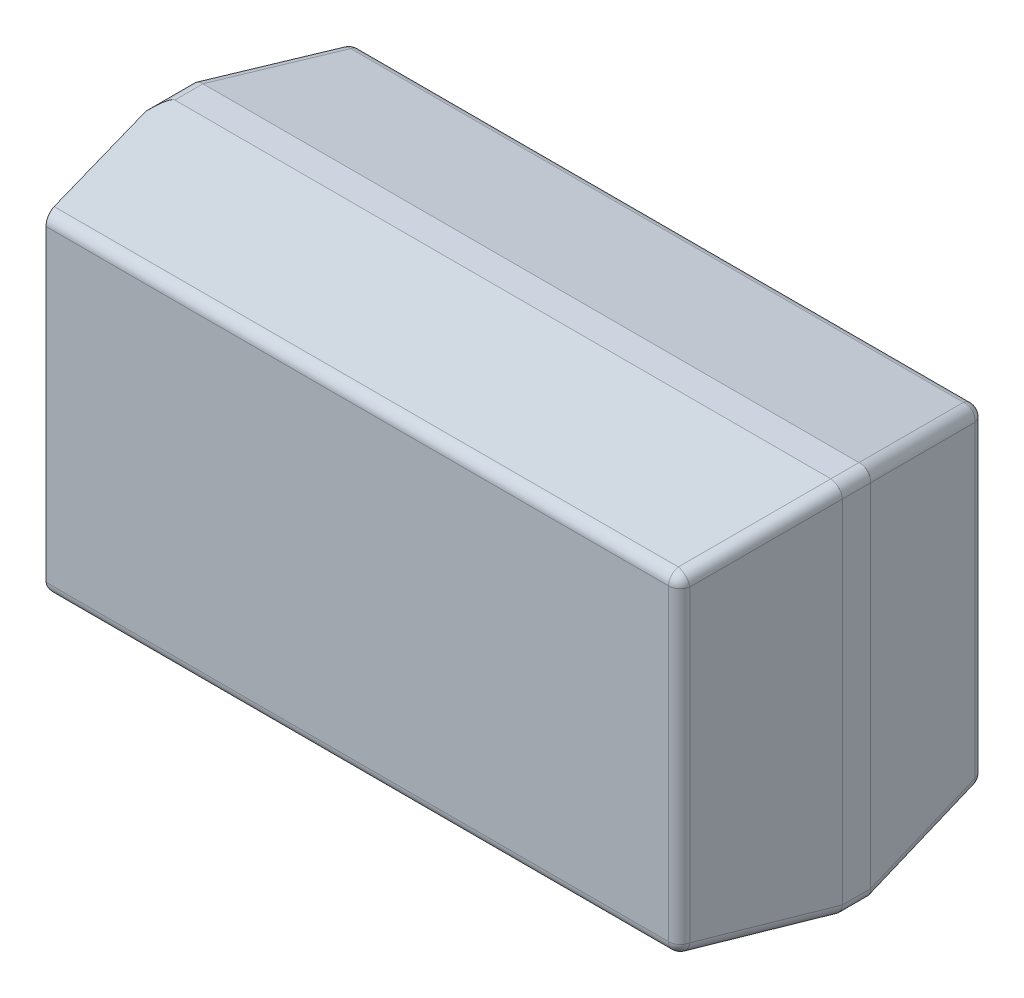
ISO-10303-21;
HEADER;
FILE_DESCRIPTION(('STEP AP214'),'2;1');
FILE_NAME('part.step','',(''),(''),'','','');
FILE_SCHEMA(('AUTOMOTIVE_DESIGN { 1 0 10303 214 1 1 1 1 }'));
ENDSEC;
DATA;
#1=APPLICATION_CONTEXT('core data for automotive mechanical design processes');
#2=APPLICATION_PROTOCOL_DEFINITION('international standard','automotive_design',2000,#1);
#3=PRODUCT_CONTEXT('',#1,'mechanical');
#4=PRODUCT('Part','Part','',(#3));
#5=PRODUCT_RELATED_PRODUCT_CATEGORY('part','',(#4));
#6=PRODUCT_DEFINITION_FORMATION('','',#4);
#7=PRODUCT_DEFINITION_CONTEXT('part definition',#1,'design');
#8=PRODUCT_DEFINITION('design','',#6,#7);
#9=PRODUCT_DEFINITION_SHAPE('','',#8);
#10=(LENGTH_UNIT() NAMED_UNIT(*) SI_UNIT(.MILLI.,.METRE.));
#11=(NAMED_UNIT(*) PLANE_ANGLE_UNIT() SI_UNIT($,.RADIAN.));
#12=(NAMED_UNIT(*) SI_UNIT($,.STERADIAN.) SOLID_ANGLE_UNIT());
#13=UNCERTAINTY_MEASURE_WITH_UNIT(LENGTH_MEASURE(1.E-05),#10,'distance_accuracy_value','');
#14=(GEOMETRIC_REPRESENTATION_CONTEXT(3) GLOBAL_UNCERTAINTY_ASSIGNED_CONTEXT((#13)) GLOBAL_UNIT_ASSIGNED_CONTEXT((#10,
#11,#12)) REPRESENTATION_CONTEXT('',''));
#15=CARTESIAN_POINT('',(0.,0.,0.));
#16=DIRECTION('',(0.,0.,1.));
#17=DIRECTION('',(1.,0.,0.));
#18=AXIS2_PLACEMENT_3D('',#15,#16,#17);
#19=CARTESIAN_POINT('',(0.99999934,-6.25000066,0.15));
#20=DIRECTION('',(0.,0.,1.));
#21=DIRECTION('',(0.,-1.,0.));
#22=AXIS2_PLACEMENT_3D('',#19,#20,#21);
#23=PLANE('',#22);
#24=DIRECTION('',(1.,1.192488068636E-08,0.));
#25=VECTOR('',#24,1.);
#26=CARTESIAN_POINT('',(0.637499347845,-6.90788363339342,0.15));
#27=LINE('',#26,#25);
#28=CARTESIAN_POINT('',(-0.307883629070424,-6.907883644667,0.15));
#29=VERTEX_POINT('',#28);
#30=CARTESIAN_POINT('',(2.3078823169156,-6.90788361347423,0.15));
#31=VERTEX_POINT('',#30);
#32=EDGE_CURVE('E371',#29,#31,#27,.T.);
#33=ORIENTED_EDGE('',*,*,#32,.F.);
#34=DIRECTION('',(0.,-1.,0.));
#35=VECTOR('',#34,1.);
#36=CARTESIAN_POINT('',(-0.307883636916,-6.25000066,0.15));
#37=LINE('',#36,#35);
#38=CARTESIAN_POINT('',(-0.3078836369156,-5.59211770652577,0.15));
#39=VERTEX_POINT('',#38);
#40=EDGE_CURVE('E494',#39,#29,#37,.T.);
#41=ORIENTED_EDGE('',*,*,#40,.F.);
#42=DIRECTION('',(-1.,-1.192488082992E-08,0.));
#43=VECTOR('',#42,1.);
#44=CARTESIAN_POINT('',(1.362499332155,-5.59211768660658,0.15));
#45=LINE('',#44,#43);
#46=CARTESIAN_POINT('',(2.30788230907042,-5.592117675333,0.15));
#47=VERTEX_POINT('',#46);
#48=EDGE_CURVE('E485',#47,#39,#45,.T.);
#49=ORIENTED_EDGE('',*,*,#48,.F.);
#50=DIRECTION('',(0.,-1.,0.));
#51=VECTOR('',#50,1.);
#52=CARTESIAN_POINT('',(2.307882316916,-6.25000066,0.15));
#53=LINE('',#52,#51);
#54=EDGE_CURVE('E492',#31,#47,#53,.F.);
#55=ORIENTED_EDGE('',*,*,#54,.F.);
#56=EDGE_LOOP('',(#33,#41,#49,#55));
#57=FACE_BOUND('',#56,.T.);
#58=ADVANCED_FACE('F17',(#57),#23,.F.);
#59=CARTESIAN_POINT('',(2.307882316916,-6.907883613474,0.2));
#60=DIRECTION('',(0.509748945017983,-0.509748932860949,-0.693045480830931));
#61=DIRECTION('',(9.6064124155415E-09,-0.805564090074895,0.592508647010156));
#62=AXIS2_PLACEMENT_3D('',#59,#60,#61);
#63=SPHERICAL_SURFACE('',#62,0.05);
#64=CARTESIAN_POINT('',(2.3333697641669,-6.93337106011705,0.165347725958453));
#65=VERTEX_POINT('',#64);
#66=VERTEX_LOOP('',#65);
#67=FACE_BOUND('',#66,.T.);
#68=CARTESIAN_POINT('',(2.3078823169152,-6.90788361347458,0.2));
#69=DIRECTION('',(-1.19248806385E-08,1.,0.));
#70=DIRECTION('',(-1.,-1.19248806385E-08,0.));
#71=AXIS2_PLACEMENT_3D('',#68,#69,#70);
#72=CIRCLE('',#71,0.05);
#73=CARTESIAN_POINT('',(2.35715532269409,-6.90788361318055,0.191504654125824));
#74=VERTEX_POINT('',#73);
#75=EDGE_CURVE('E476',#74,#31,#72,.T.);
#76=ORIENTED_EDGE('',*,*,#75,.F.);
#77=CARTESIAN_POINT('',(2.30788231691543,-6.90788361347411,0.200000000000336));
#78=DIRECTION('',(0.167506304540914,-0.167506300545914,0.971536554750499));
#79=DIRECTION('',(0.985460115405062,0.,-0.169906918475503));
#80=AXIS2_PLACEMENT_3D('',#77,#78,#79);
#81=CIRCLE('',#80,0.05);
#82=CARTESIAN_POINT('',(2.30788231795353,-6.95715661971173,0.19150465678629));
#83=VERTEX_POINT('',#82);
#84=EDGE_CURVE('E374',#83,#74,#81,.T.);
#85=ORIENTED_EDGE('',*,*,#84,.F.);
#86=CARTESIAN_POINT('',(2.307882316916,-6.90788361347388,0.2));
#87=DIRECTION('',(1.,1.192488068636E-08,0.));
#88=DIRECTION('',(-1.192488068636E-08,1.,0.));
#89=AXIS2_PLACEMENT_3D('',#86,#87,#88);
#90=CIRCLE('',#89,0.05);
#91=EDGE_CURVE('E375',#31,#83,#90,.F.);
#92=ORIENTED_EDGE('',*,*,#91,.F.);
#93=EDGE_LOOP('',(#76,#85,#92));
#94=FACE_BOUND('',#93,.T.);
#95=ADVANCED_FACE('F387',(#67,#94),#63,.T.);
#96=CARTESIAN_POINT('',(2.307882301225,-5.592117675333,0.2));
#97=DIRECTION('',(0.509748932860093,0.509748945018262,-0.693045480831356));
#98=DIRECTION('',(9.6062828802701E-09,-0.805564090075176,-0.592508647009774));
#99=AXIS2_PLACEMENT_3D('',#96,#97,#98);
#100=SPHERICAL_SURFACE('',#99,0.05);
#101=CARTESIAN_POINT('',(2.333369747868,-5.56663022808209,0.165347725958432));
#102=VERTEX_POINT('',#101);
#103=VERTEX_LOOP('',#102);
#104=FACE_BOUND('',#103,.T.);
#105=CARTESIAN_POINT('',(2.30788230122542,-5.59211767533274,0.200000000000312));
#106=DIRECTION('',(-0.167506300545914,-0.167506304540914,-0.971536554750499));
#107=DIRECTION('',(0.,0.985460115405062,-0.169906918475503));
#108=AXIS2_PLACEMENT_3D('',#105,#106,#107);
#109=CIRCLE('',#108,0.05);
#110=CARTESIAN_POINT('',(2.35715530723907,-5.59211767451953,0.191504655488608));
#111=VERTEX_POINT('',#110);
#112=CARTESIAN_POINT('',(2.30788230093171,-5.54284466955431,0.19150465412578));
#113=VERTEX_POINT('',#112);
#114=EDGE_CURVE('E362',#111,#113,#109,.F.);
#115=ORIENTED_EDGE('',*,*,#114,.F.);
#116=CARTESIAN_POINT('',(2.30788230122485,-5.592117675333,0.2));
#117=DIRECTION('',(-1.19248806385E-08,1.,0.));
#118=DIRECTION('',(-1.,-1.19248806385E-08,0.));
#119=AXIS2_PLACEMENT_3D('',#116,#117,#118);
#120=CIRCLE('',#119,0.05);
#121=EDGE_CURVE('E479',#47,#111,#120,.F.);
#122=ORIENTED_EDGE('',*,*,#121,.F.);
#123=CARTESIAN_POINT('',(2.30788230122557,-5.59211767533342,0.2));
#124=DIRECTION('',(-1.,-1.192488082992E-08,0.));
#125=DIRECTION('',(1.192488082992E-08,-1.,0.));
#126=AXIS2_PLACEMENT_3D('',#123,#124,#125);
#127=CIRCLE('',#126,0.05);
#128=EDGE_CURVE('E486',#113,#47,#127,.T.);
#129=ORIENTED_EDGE('',*,*,#128,.F.);
#130=EDGE_LOOP('',(#115,#122,#129));
#131=FACE_BOUND('',#130,.T.);
#132=ADVANCED_FACE('F383',(#104,#131),#100,.T.);
#133=CARTESIAN_POINT('',(1.362499332155,-5.592117686607,0.2));
#134=DIRECTION('',(-1.,-1.192488082992E-08,0.));
#135=DIRECTION('',(1.192488082992E-08,-1.,0.));
#136=AXIS2_PLACEMENT_3D('',#133,#134,#135);
#137=CYLINDRICAL_SURFACE('',#136,0.05);
#138=ORIENTED_EDGE('',*,*,#128,.T.);
#139=ORIENTED_EDGE('',*,*,#48,.T.);
#140=CARTESIAN_POINT('',(-0.307883636916001,-5.59211770652612,0.2));
#141=DIRECTION('',(-1.,-1.192488082992E-08,0.));
#142=DIRECTION('',(1.192488082992E-08,-1.,0.));
#143=AXIS2_PLACEMENT_3D('',#140,#141,#142);
#144=CIRCLE('',#143,0.05);
#145=CARTESIAN_POINT('',(-0.307883637953513,-5.54284470028823,0.191504656786286));
#146=VERTEX_POINT('',#145);
#147=EDGE_CURVE('E20',#39,#146,#144,.F.);
#148=ORIENTED_EDGE('',*,*,#147,.T.);
#149=DIRECTION('',(1.,1.15806290738619E-08,-1.99666018515347E-09));
#150=VECTOR('',#149,1.);
#151=CARTESIAN_POINT('',(1.724999331056,-5.5428446762957,0.191504655338741));
#152=LINE('',#151,#150);
#153=EDGE_CURVE('E356',#113,#146,#152,.F.);
#154=ORIENTED_EDGE('',*,*,#153,.F.);
#155=EDGE_LOOP('',(#138,#139,#148,#154));
#156=FACE_BOUND('',#155,.T.);
#157=ADVANCED_FACE('F386',(#156),#137,.T.);
#158=CARTESIAN_POINT('',(0.637499347845,-6.907883633393,0.2));
#159=DIRECTION('',(1.,1.192488068636E-08,0.));
#160=DIRECTION('',(-1.192488068636E-08,1.,0.));
#161=AXIS2_PLACEMENT_3D('',#158,#159,#160);
#162=CYLINDRICAL_SURFACE('',#161,0.05);
#163=CARTESIAN_POINT('',(-0.307883621225575,-6.90788364466658,0.2));
#164=DIRECTION('',(1.,1.192488068636E-08,0.));
#165=DIRECTION('',(-1.192488068636E-08,1.,0.));
#166=AXIS2_PLACEMENT_3D('',#163,#164,#165);
#167=CIRCLE('',#166,0.05);
#168=CARTESIAN_POINT('',(-0.307883620637998,-6.95715665045416,0.191504654174933));
#169=VERTEX_POINT('',#168);
#170=EDGE_CURVE('E470',#29,#169,#167,.F.);
#171=ORIENTED_EDGE('',*,*,#170,.F.);
#172=ORIENTED_EDGE('',*,*,#32,.T.);
#173=ORIENTED_EDGE('',*,*,#91,.T.);
#174=DIRECTION('',(1.,1.15806289344489E-08,1.99666016111674E-09));
#175=VECTOR('',#174,1.);
#176=CARTESIAN_POINT('',(0.274999348944,-6.9571566437043,0.191504655338742));
#177=LINE('',#176,#175);
#178=EDGE_CURVE('E323',#169,#83,#177,.T.);
#179=ORIENTED_EDGE('',*,*,#178,.F.);
#180=EDGE_LOOP('',(#171,#172,#173,#179));
#181=FACE_BOUND('',#180,.T.);
#182=ADVANCED_FACE('F597',(#181),#162,.T.);
#183=CARTESIAN_POINT('',(2.317386639752,-6.917387936084,0.255125071795));
#184=DIRECTION('',(0.167506304540914,-0.167506300545914,0.971536554750499));
#185=DIRECTION('',(0.985460115405062,0.,-0.169906918475503));
#186=AXIS2_PLACEMENT_3D('',#183,#184,#185);
#187=CYLINDRICAL_SURFACE('',#186,0.05);
#188=DIRECTION('',(-0.167506304541096,0.167506300545522,-0.971536554750535));
#189=VECTOR('',#188,1.);
#190=CARTESIAN_POINT('',(2.44999413895639,-7.000722426926,0.729969782022933));
#191=LINE('',#190,#189);
#192=CARTESIAN_POINT('',(2.44999674394723,-7.0003615349154,0.729984890995096));
#193=VERTEX_POINT('',#192);
#194=EDGE_CURVE('E310',#193,#74,#191,.T.);
#195=ORIENTED_EDGE('',*,*,#194,.F.);
#196=CARTESIAN_POINT('',(2.39999934894383,-7.00000064330518,0.734278779392058));
#197=DIRECTION('',(0.0843555658038492,-0.0843555637919818,0.992858639170375));
#198=DIRECTION('',(-0.702057084888997,0.702057068145042,0.119296783798854));
#199=AXIS2_PLACEMENT_3D('',#196,#197,#198);
#200=ELLIPSE('',#199,0.050359636334312,0.05);
#201=CARTESIAN_POINT('',(2.4003602416485,-7.04999803830289,0.729984891011509));
#202=VERTEX_POINT('',#201);
#203=EDGE_CURVE('E313',#202,#193,#200,.T.);
#204=ORIENTED_EDGE('',*,*,#203,.F.);
#205=DIRECTION('',(0.167506304541879,-0.167506300546071,0.971536554750305));
#206=VECTOR('',#205,1.);
#207=CARTESIAN_POINT('',(2.307882317503,-6.95715661926175,0.191504654174872));
#208=LINE('',#207,#206);
#209=EDGE_CURVE('E320',#83,#202,#208,.T.);
#210=ORIENTED_EDGE('',*,*,#209,.F.);
#211=ORIENTED_EDGE('',*,*,#84,.T.);
#212=EDGE_LOOP('',(#195,#204,#210,#211));
#213=FACE_BOUND('',#212,.T.);
#214=ADVANCED_FACE('F601',(#213),#187,.T.);
#215=CARTESIAN_POINT('',(2.307882311455,-6.450000644404,0.2));
#216=DIRECTION('',(-1.19248806385E-08,1.,0.));
#217=DIRECTION('',(-1.,-1.19248806385E-08,0.));
#218=AXIS2_PLACEMENT_3D('',#215,#216,#217);
#219=CYLINDRICAL_SURFACE('',#218,0.05);
#220=ORIENTED_EDGE('',*,*,#75,.T.);
#221=ORIENTED_EDGE('',*,*,#54,.T.);
#222=ORIENTED_EDGE('',*,*,#121,.T.);
#223=DIRECTION('',(-1.15806288879746E-08,1.,1.99666015310392E-09));
#224=VECTOR('',#223,1.);
#225=CARTESIAN_POINT('',(2.35715531971643,-6.650000643305,0.191504654689925));
#226=LINE('',#225,#224);
#227=EDGE_CURVE('E307',#74,#111,#226,.T.);
#228=ORIENTED_EDGE('',*,*,#227,.F.);
#229=EDGE_LOOP('',(#220,#221,#222,#228));
#230=FACE_BOUND('',#229,.T.);
#231=ADVANCED_FACE('F591',(#230),#219,.T.);
#232=CARTESIAN_POINT('',(2.326505591179,-5.573494384935,0.308015083019));
#233=DIRECTION('',(-0.167506300545914,-0.167506304540914,-0.971536554750499));
#234=DIRECTION('',(0.,0.985460115405062,-0.169906918475503));
#235=AXIS2_PLACEMENT_3D('',#232,#233,#234);
#236=CYLINDRICAL_SURFACE('',#235,0.05);
#237=DIRECTION('',(-0.167506300545522,-0.167506304541096,-0.971536554750535));
#238=VECTOR('',#237,1.);
#239=CARTESIAN_POINT('',(2.400721114677,-5.45000585329204,0.729969782022834));
#240=LINE('',#239,#238);
#241=CARTESIAN_POINT('',(2.40036022266644,-5.45000324830154,0.729984890995048));
#242=VERTEX_POINT('',#241);
#243=EDGE_CURVE('E359',#242,#113,#240,.T.);
#244=ORIENTED_EDGE('',*,*,#243,.F.);
#245=CARTESIAN_POINT('',(2.39999933105605,-5.50000064330505,0.734278779388728));
#246=DIRECTION('',(0.0843555637919818,0.0843555658038492,0.992858639170375));
#247=DIRECTION('',(-0.702057068145042,-0.702057084888997,0.119296783798854));
#248=AXIS2_PLACEMENT_3D('',#245,#246,#247);
#249=ELLIPSE('',#248,0.050359636334312,0.05);
#250=CARTESIAN_POINT('',(2.44999672605408,-5.4996397506005,0.729984891011507));
#251=VERTEX_POINT('',#250);
#252=EDGE_CURVE('E301',#251,#242,#249,.T.);
#253=ORIENTED_EDGE('',*,*,#252,.F.);
#254=DIRECTION('',(0.16750630054607,0.167506304541931,0.971536554750296));
#255=VECTOR('',#254,1.);
#256=CARTESIAN_POINT('',(2.35715530701254,-5.592117674746,0.191504654175079));
#257=LINE('',#256,#255);
#258=EDGE_CURVE('E304',#111,#251,#257,.T.);
#259=ORIENTED_EDGE('',*,*,#258,.F.);
#260=ORIENTED_EDGE('',*,*,#114,.T.);
#261=EDGE_LOOP('',(#244,#253,#259,#260));
#262=FACE_BOUND('',#261,.T.);
#263=ADVANCED_FACE('F562',(#262),#236,.T.);
#264=CARTESIAN_POINT('',(1.724999331056,-5.500000651354,0.44));
#265=DIRECTION('',(-1.17514944428933E-08,0.985460115744279,-0.169906916508048));
#266=DIRECTION('',(0.,0.169906916508048,0.985460115744279));
#267=AXIS2_PLACEMENT_3D('',#264,#265,#266);
#268=PLANE('',#267);
#269=ORIENTED_EDGE('',*,*,#153,.T.);
#270=DIRECTION('',(-0.16750630454188,0.167506300546071,0.971536554750305));
#271=VECTOR('',#270,1.);
#272=CARTESIAN_POINT('',(-0.307883637503,-5.54284470073825,0.191504654174872));
#273=LINE('',#272,#271);
#274=CARTESIAN_POINT('',(-0.400361561648499,-5.45000328169711,0.729984891011509));
#275=VERTEX_POINT('',#274);
#276=EDGE_CURVE('E352',#146,#275,#273,.T.);
#277=ORIENTED_EDGE('',*,*,#276,.T.);
#278=DIRECTION('',(-1.,-1.192488082992E-08,0.));
#279=VECTOR('',#278,1.);
#280=CARTESIAN_POINT('',(2.44999933046,-5.450000642709,0.73));
#281=LINE('',#280,#279);
#282=EDGE_CURVE('E296',#242,#275,#281,.T.);
#283=ORIENTED_EDGE('',*,*,#282,.F.);
#284=ORIENTED_EDGE('',*,*,#243,.T.);
#285=EDGE_LOOP('',(#269,#277,#283,#284));
#286=FACE_BOUND('',#285,.T.);
#287=ADVANCED_FACE('F347',(#286),#268,.T.);
#288=CARTESIAN_POINT('',(-0.307883636916,-5.592117706526,0.2));
#289=DIRECTION('',(-0.509748945017983,0.509748932860949,-0.693045480830931));
#290=DIRECTION('',(9.6064124155415E-09,-0.805564090074895,-0.592508647010156));
#291=AXIS2_PLACEMENT_3D('',#288,#289,#290);
#292=SPHERICAL_SURFACE('',#291,0.05);
#293=CARTESIAN_POINT('',(-0.333371084166899,-5.56663025988295,0.165347725958453));
#294=VERTEX_POINT('',#293);
#295=VERTEX_LOOP('',#294);
#296=FACE_BOUND('',#295,.T.);
#297=CARTESIAN_POINT('',(-0.307883636915431,-5.59211770652589,0.200000000000336));
#298=DIRECTION('',(0.167506304540914,-0.167506300545914,-0.971536554750499));
#299=DIRECTION('',(-0.985460115405062,0.,-0.169906918475503));
#300=AXIS2_PLACEMENT_3D('',#297,#298,#299);
#301=CIRCLE('',#300,0.05);
#302=CARTESIAN_POINT('',(-0.357156642694283,-5.59211770681945,0.191504654125791));
#303=VERTEX_POINT('',#302);
#304=EDGE_CURVE('E290',#146,#303,#301,.F.);
#305=ORIENTED_EDGE('',*,*,#304,.F.);
#306=ORIENTED_EDGE('',*,*,#147,.F.);
#307=CARTESIAN_POINT('',(-0.3078836369152,-5.59211770652542,0.2));
#308=DIRECTION('',(1.19248806385E-08,-1.,0.));
#309=DIRECTION('',(1.,1.19248806385E-08,0.));
#310=AXIS2_PLACEMENT_3D('',#307,#308,#309);
#311=CIRCLE('',#310,0.05);
#312=EDGE_CURVE('E355',#303,#39,#311,.T.);
#313=ORIENTED_EDGE('',*,*,#312,.F.);
#314=EDGE_LOOP('',(#305,#306,#313));
#315=FACE_BOUND('',#314,.T.);
#316=ADVANCED_FACE('F343',(#296,#315),#292,.T.);
#317=CARTESIAN_POINT('',(-0.307883631455,-6.050000675596,0.2));
#318=DIRECTION('',(1.19248806385E-08,-1.,0.));
#319=DIRECTION('',(1.,1.19248806385E-08,0.));
#320=AXIS2_PLACEMENT_3D('',#317,#318,#319);
#321=CYLINDRICAL_SURFACE('',#320,0.05);
#322=ORIENTED_EDGE('',*,*,#312,.T.);
#323=ORIENTED_EDGE('',*,*,#40,.T.);
#324=CARTESIAN_POINT('',(-0.307883621224848,-6.907883644667,0.2));
#325=DIRECTION('',(1.19248806385E-08,-1.,0.));
#326=DIRECTION('',(1.,1.19248806385E-08,0.));
#327=AXIS2_PLACEMENT_3D('',#324,#325,#326);
#328=CIRCLE('',#327,0.05);
#329=CARTESIAN_POINT('',(-0.357156627465515,-6.90788363763576,0.191504656802153));
#330=VERTEX_POINT('',#329);
#331=EDGE_CURVE('E328',#330,#29,#328,.T.);
#332=ORIENTED_EDGE('',*,*,#331,.F.);
#333=DIRECTION('',(-1.15806288879746E-08,1.,-1.99666015310392E-09));
#334=VECTOR('',#333,1.);
#335=CARTESIAN_POINT('',(-0.357156639716434,-5.850000676695,0.191504654689925));
#336=LINE('',#335,#334);
#337=EDGE_CURVE('E276',#303,#330,#336,.F.);
#338=ORIENTED_EDGE('',*,*,#337,.F.);
#339=EDGE_LOOP('',(#322,#323,#332,#338));
#340=FACE_BOUND('',#339,.T.);
#341=ADVANCED_FACE('F338',(#340),#321,.T.);
#342=CARTESIAN_POINT('',(-0.307883621225,-6.907883644667,0.2));
#343=DIRECTION('',(-0.509748932860093,-0.509748945018262,-0.693045480831356));
#344=DIRECTION('',(9.6062828802701E-09,-0.805564090075176,0.592508647009774));
#345=AXIS2_PLACEMENT_3D('',#342,#343,#344);
#346=SPHERICAL_SURFACE('',#345,0.05);
#347=CARTESIAN_POINT('',(-0.333371067868005,-6.93337109191791,0.165347725958432));
#348=VERTEX_POINT('',#347);
#349=VERTEX_LOOP('',#348);
#350=FACE_BOUND('',#349,.T.);
#351=CARTESIAN_POINT('',(-0.307883621225421,-6.90788364466726,0.200000000000312));
#352=DIRECTION('',(0.167506300545914,0.167506304540914,-0.971536554750499));
#353=DIRECTION('',(0.,0.985460115405062,0.169906918475503));
#354=AXIS2_PLACEMENT_3D('',#351,#352,#353);
#355=CIRCLE('',#354,0.05);
#356=EDGE_CURVE('E270',#330,#169,#355,.F.);
#357=ORIENTED_EDGE('',*,*,#356,.F.);
#358=ORIENTED_EDGE('',*,*,#331,.T.);
#359=ORIENTED_EDGE('',*,*,#170,.T.);
#360=EDGE_LOOP('',(#357,#358,#359));
#361=FACE_BOUND('',#360,.T.);
#362=ADVANCED_FACE('F333',(#350,#361),#346,.T.);
#363=CARTESIAN_POINT('',(0.274999348944,-7.000000668646,0.44));
#364=DIRECTION('',(1.17514943014233E-08,-0.985460115744279,-0.169906916508048));
#365=DIRECTION('',(0.,0.169906916508048,-0.985460115744279));
#366=AXIS2_PLACEMENT_3D('',#363,#364,#365);
#367=PLANE('',#366);
#368=ORIENTED_EDGE('',*,*,#209,.T.);
#369=DIRECTION('',(1.,1.192488068636E-08,0.));
#370=VECTOR('',#369,1.);
#371=CARTESIAN_POINT('',(-0.45000065046,-7.050000677291,0.73));
#372=LINE('',#371,#370);
#373=CARTESIAN_POINT('',(-0.400361542717501,-7.04999807170134,0.729984891011449));
#374=VERTEX_POINT('',#373);
#375=EDGE_CURVE('E264',#374,#202,#372,.T.);
#376=ORIENTED_EDGE('',*,*,#375,.F.);
#377=DIRECTION('',(0.167506300545914,0.167506304540914,-0.971536554750499));
#378=VECTOR('',#377,1.);
#379=CARTESIAN_POINT('',(-0.326506910591575,-6.97577994085221,0.299519737193581));
#380=LINE('',#379,#378);
#381=EDGE_CURVE('E267',#169,#374,#380,.F.);
#382=ORIENTED_EDGE('',*,*,#381,.F.);
#383=ORIENTED_EDGE('',*,*,#178,.T.);
#384=EDGE_LOOP('',(#368,#376,#382,#383));
#385=FACE_BOUND('',#384,.T.);
#386=ADVANCED_FACE('F337',(#385),#367,.T.);
#387=CARTESIAN_POINT('',(2.399999348944,-7.000000643305,0.15));
#388=DIRECTION('',(0.,0.,1.));
#389=DIRECTION('',(0.,-1.,0.));
#390=AXIS2_PLACEMENT_3D('',#387,#388,#389);
#391=CYLINDRICAL_SURFACE('',#390,0.05);
#392=DIRECTION('',(0.,0.,1.));
#393=VECTOR('',#392,1.);
#394=CARTESIAN_POINT('',(2.39999934954,-7.05000064330509,0.15));
#395=LINE('',#394,#393);
#396=CARTESIAN_POINT('',(2.400337218235,-7.04999836009191,0.850013699256059));
#397=VERTEX_POINT('',#396);
#398=EDGE_CURVE('E261',#202,#397,#395,.T.);
#399=ORIENTED_EDGE('',*,*,#398,.F.);
#400=ORIENTED_EDGE('',*,*,#203,.T.);
#401=DIRECTION('',(0.,0.,1.));
#402=VECTOR('',#401,1.);
#403=CARTESIAN_POINT('',(2.44999934894376,-7.000000642709,0.15));
#404=LINE('',#403,#402);
#405=CARTESIAN_POINT('',(2.44999706573434,-7.000338511551,0.85001369927981));
#406=VERTEX_POINT('',#405);
#407=EDGE_CURVE('E249',#406,#193,#404,.F.);
#408=ORIENTED_EDGE('',*,*,#407,.F.);
#409=CARTESIAN_POINT('',(2.39999934894376,-7.00000064330525,0.845861873484004));
#410=DIRECTION('',(-0.0816570172297478,0.0816570152822183,0.993309751986932));
#411=DIRECTION('',(-0.702376069824563,0.702376053072811,-0.115480459852131));
#412=AXIS2_PLACEMENT_3D('',#409,#410,#411);
#413=ELLIPSE('',#412,0.0503367654450027,0.05);
#414=EDGE_CURVE('E258',#397,#406,#413,.T.);
#415=ORIENTED_EDGE('',*,*,#414,.F.);
#416=EDGE_LOOP('',(#399,#400,#408,#415));
#417=FACE_BOUND('',#416,.T.);
#418=ADVANCED_FACE('F637',(#417),#391,.T.);
#419=CARTESIAN_POINT('',(2.39999934477,-6.650000643305,0.44));
#420=DIRECTION('',(0.985460115744279,1.17514942542633E-08,-0.169906916508048));
#421=DIRECTION('',(-0.169906916508048,0.,-0.985460115744279));
#422=AXIS2_PLACEMENT_3D('',#419,#420,#421);
#423=PLANE('',#422);
#424=ORIENTED_EDGE('',*,*,#227,.T.);
#425=ORIENTED_EDGE('',*,*,#258,.T.);
#426=DIRECTION('',(-1.19248806385E-08,1.,0.));
#427=VECTOR('',#426,1.);
#428=CARTESIAN_POINT('',(2.44999934954,-7.050000642709,0.73));
#429=LINE('',#428,#427);
#430=EDGE_CURVE('E252',#193,#251,#429,.T.);
#431=ORIENTED_EDGE('',*,*,#430,.F.);
#432=ORIENTED_EDGE('',*,*,#194,.T.);
#433=EDGE_LOOP('',(#424,#425,#431,#432));
#434=FACE_BOUND('',#433,.T.);
#435=ADVANCED_FACE('F589',(#434),#423,.T.);
#436=CARTESIAN_POINT('',(2.399999331056,-5.500000643305,0.15));
#437=DIRECTION('',(0.,0.,1.));
#438=DIRECTION('',(0.,-1.,0.));
#439=AXIS2_PLACEMENT_3D('',#436,#437,#438);
#440=CYLINDRICAL_SURFACE('',#439,0.05);
#441=DIRECTION('',(0.,0.,1.));
#442=VECTOR('',#441,1.);
#443=CARTESIAN_POINT('',(2.44999933105644,-5.500000642709,0.15));
#444=LINE('',#443,#442);
#445=CARTESIAN_POINT('',(2.44999704784291,-5.499662774014,0.850013699255989));
#446=VERTEX_POINT('',#445);
#447=EDGE_CURVE('E253',#251,#446,#444,.T.);
#448=ORIENTED_EDGE('',*,*,#447,.F.);
#449=ORIENTED_EDGE('',*,*,#252,.T.);
#450=DIRECTION('',(0.,0.,1.));
#451=VECTOR('',#450,1.);
#452=CARTESIAN_POINT('',(2.39999933046,-5.45000064330524,0.15));
#453=LINE('',#452,#451);
#454=CARTESIAN_POINT('',(2.400337199155,-5.4500029265104,0.850013699256017));
#455=VERTEX_POINT('',#454);
#456=EDGE_CURVE('E293',#455,#242,#453,.F.);
#457=ORIENTED_EDGE('',*,*,#456,.F.);
#458=CARTESIAN_POINT('',(2.39999933105624,-5.50000064330524,0.845861873484108));
#459=DIRECTION('',(-0.0816570152822183,-0.0816570172297478,0.993309751986932));
#460=DIRECTION('',(-0.702376053072811,-0.702376069824563,-0.115480459852131));
#461=AXIS2_PLACEMENT_3D('',#458,#459,#460);
#462=ELLIPSE('',#461,0.0503367654450027,0.05);
#463=EDGE_CURVE('E248',#446,#455,#462,.T.);
#464=ORIENTED_EDGE('',*,*,#463,.F.);
#465=EDGE_LOOP('',(#448,#449,#457,#464));
#466=FACE_BOUND('',#465,.T.);
#467=ADVANCED_FACE('F568',(#466),#440,.T.);
#468=CARTESIAN_POINT('',(2.44999933046,-5.450000642709,0.15));
#469=DIRECTION('',(-1.192488082992E-08,1.,0.));
#470=DIRECTION('',(-1.,-1.192488082992E-08,0.));
#471=AXIS2_PLACEMENT_3D('',#468,#469,#470);
#472=PLANE('',#471);
#473=ORIENTED_EDGE('',*,*,#456,.T.);
#474=ORIENTED_EDGE('',*,*,#282,.T.);
#475=DIRECTION('',(0.,0.,1.));
#476=VECTOR('',#475,1.);
#477=CARTESIAN_POINT('',(-0.40000066954,-5.45000067669491,0.15));
#478=LINE('',#477,#476);
#479=CARTESIAN_POINT('',(-0.400000669532065,-5.45000067646924,0.849999997294326));
#480=VERTEX_POINT('',#479);
#481=EDGE_CURVE('E297',#275,#480,#478,.T.);
#482=ORIENTED_EDGE('',*,*,#481,.T.);
#483=DIRECTION('',(1.,1.16025867534431E-08,1.93376445890326E-09));
#484=VECTOR('',#483,1.);
#485=CARTESIAN_POINT('',(1.724999331056,-5.45000065113656,0.84999999869474));
#486=LINE('',#485,#484);
#487=EDGE_CURVE('E235',#455,#480,#486,.F.);
#488=ORIENTED_EDGE('',*,*,#487,.F.);
#489=EDGE_LOOP('',(#473,#474,#482,#488));
#490=FACE_BOUND('',#489,.T.);
#491=ADVANCED_FACE('F571',(#490),#472,.T.);
#492=CARTESIAN_POINT('',(-0.317387959752,-5.582613383916,0.255125071795));
#493=DIRECTION('',(0.167506304540914,-0.167506300545914,-0.971536554750499));
#494=DIRECTION('',(-0.985460115405062,0.,-0.169906918475503));
#495=AXIS2_PLACEMENT_3D('',#492,#493,#494);
#496=CYLINDRICAL_SURFACE('',#495,0.05);
#497=DIRECTION('',(0.167506304541096,-0.167506300545522,-0.971536554750535));
#498=VECTOR('',#497,1.);
#499=CARTESIAN_POINT('',(-0.449995458956391,-5.499278893074,0.729969782022933));
#500=LINE('',#499,#498);
#501=CARTESIAN_POINT('',(-0.449998063947231,-5.4996397850846,0.729984890995096));
#502=VERTEX_POINT('',#501);
#503=EDGE_CURVE('E287',#502,#303,#500,.T.);
#504=ORIENTED_EDGE('',*,*,#503,.F.);
#505=CARTESIAN_POINT('',(-0.400000668943825,-5.50000067669482,0.734278779392058));
#506=DIRECTION('',(-0.0843555658038492,0.0843555637919818,0.992858639170375));
#507=DIRECTION('',(0.702057084888997,-0.702057068145042,0.119296783798854));
#508=AXIS2_PLACEMENT_3D('',#505,#506,#507);
#509=ELLIPSE('',#508,0.050359636334312,0.05);
#510=EDGE_CURVE('E232',#275,#502,#509,.T.);
#511=ORIENTED_EDGE('',*,*,#510,.F.);
#512=ORIENTED_EDGE('',*,*,#276,.F.);
#513=ORIENTED_EDGE('',*,*,#304,.T.);
#514=EDGE_LOOP('',(#504,#511,#512,#513));
#515=FACE_BOUND('',#514,.T.);
#516=ADVANCED_FACE('F662',(#515),#496,.T.);
#517=CARTESIAN_POINT('',(-0.40000066477,-5.850000676695,0.44));
#518=DIRECTION('',(-0.985460115744279,-1.17514942542633E-08,-0.169906916508048));
#519=DIRECTION('',(-0.169906916508048,0.,0.985460115744279));
#520=AXIS2_PLACEMENT_3D('',#517,#518,#519);
#521=PLANE('',#520);
#522=DIRECTION('',(0.167506300545914,0.167506304540914,-0.971536554750499));
#523=VECTOR('',#522,1.);
#524=CARTESIAN_POINT('',(-0.375779916966223,-6.92650693565231,0.299519737193652));
#525=LINE('',#524,#523);
#526=CARTESIAN_POINT('',(-0.449998046053971,-7.0003615693995,0.729984891011506));
#527=VERTEX_POINT('',#526);
#528=EDGE_CURVE('E273',#527,#330,#525,.T.);
#529=ORIENTED_EDGE('',*,*,#528,.F.);
#530=DIRECTION('',(1.19248806385E-08,-1.,0.));
#531=VECTOR('',#530,1.);
#532=CARTESIAN_POINT('',(-0.45000066954,-5.450000677291,0.73));
#533=LINE('',#532,#531);
#534=EDGE_CURVE('E226',#502,#527,#533,.T.);
#535=ORIENTED_EDGE('',*,*,#534,.F.);
#536=ORIENTED_EDGE('',*,*,#503,.T.);
#537=ORIENTED_EDGE('',*,*,#337,.T.);
#538=EDGE_LOOP('',(#529,#535,#536,#537));
#539=FACE_BOUND('',#538,.T.);
#540=ADVANCED_FACE('F669',(#539),#521,.T.);
#541=CARTESIAN_POINT('',(-0.326506911179,-6.926506935065,0.308015083019));
#542=DIRECTION('',(0.167506300545914,0.167506304540914,-0.971536554750499));
#543=DIRECTION('',(0.,0.985460115405062,0.169906918475503));
#544=AXIS2_PLACEMENT_3D('',#541,#542,#543);
#545=CYLINDRICAL_SURFACE('',#544,0.05);
#546=ORIENTED_EDGE('',*,*,#381,.T.);
#547=CARTESIAN_POINT('',(-0.400000651056046,-7.00000067669495,0.734278779388726));
#548=DIRECTION('',(-0.0843555637919818,-0.0843555658038492,0.992858639170375));
#549=DIRECTION('',(0.702057068145042,0.702057084888997,0.119296783798854));
#550=AXIS2_PLACEMENT_3D('',#547,#548,#549);
#551=ELLIPSE('',#550,0.050359636334312,0.05);
#552=EDGE_CURVE('E215',#527,#374,#551,.T.);
#553=ORIENTED_EDGE('',*,*,#552,.F.);
#554=ORIENTED_EDGE('',*,*,#528,.T.);
#555=ORIENTED_EDGE('',*,*,#356,.T.);
#556=EDGE_LOOP('',(#546,#553,#554,#555));
#557=FACE_BOUND('',#556,.T.);
#558=ADVANCED_FACE('F677',(#557),#545,.T.);
#559=CARTESIAN_POINT('',(-0.45000065046,-7.050000677291,0.15));
#560=DIRECTION('',(1.192488068636E-08,-1.,0.));
#561=DIRECTION('',(1.,1.192488068636E-08,0.));
#562=AXIS2_PLACEMENT_3D('',#559,#560,#561);
#563=PLANE('',#562);
#564=ORIENTED_EDGE('',*,*,#398,.T.);
#565=DIRECTION('',(1.,1.16025866137598E-08,-1.93376443562272E-09));
#566=VECTOR('',#565,1.);
#567=CARTESIAN_POINT('',(0.274999348944,-7.05000066886344,0.84999999869474));
#568=LINE('',#567,#566);
#569=CARTESIAN_POINT('',(-0.400338519304001,-7.04999839348952,0.850013699255994));
#570=VERTEX_POINT('',#569);
#571=EDGE_CURVE('E210',#570,#397,#568,.T.);
#572=ORIENTED_EDGE('',*,*,#571,.F.);
#573=DIRECTION('',(0.,0.,1.));
#574=VECTOR('',#573,1.);
#575=CARTESIAN_POINT('',(-0.400000651056,-7.050000676695,0.15));
#576=LINE('',#575,#574);
#577=EDGE_CURVE('E221',#374,#570,#576,.T.);
#578=ORIENTED_EDGE('',*,*,#577,.F.);
#579=ORIENTED_EDGE('',*,*,#375,.T.);
#580=EDGE_LOOP('',(#564,#572,#578,#579));
#581=FACE_BOUND('',#580,.T.);
#582=ADVANCED_FACE('F685',(#581),#563,.T.);
#583=CARTESIAN_POINT('',(2.319411749059,-6.919413045343,1.329387467026));
#584=DIRECTION('',(-0.162221423064947,0.162221419195947,0.973328526784681));
#585=DIRECTION('',(0.986393923514285,0.,0.164398989212511));
#586=AXIS2_PLACEMENT_3D('',#583,#584,#585);
#587=CYLINDRICAL_SURFACE('',#586,0.05);
#588=DIRECTION('',(-0.162221423066562,0.162221419195937,0.973328526784413));
#589=VECTOR('',#588,1.);
#590=CARTESIAN_POINT('',(2.40067508693,-7.04999607687878,0.85002739851213));
#591=LINE('',#590,#589);
#592=CARTESIAN_POINT('',(2.307642994011,-6.95696398617944,1.40821994936505));
#593=VERTEX_POINT('',#592);
#594=EDGE_CURVE('E206',#397,#593,#591,.T.);
#595=ORIENTED_EDGE('',*,*,#594,.F.);
#596=ORIENTED_EDGE('',*,*,#414,.T.);
#597=DIRECTION('',(0.162221423064888,-0.162221419197257,-0.973328526784472));
#598=VECTOR('',#597,1.);
#599=CARTESIAN_POINT('',(2.35696268919104,-6.90764428897508,1.40821995190851));
#600=LINE('',#599,#598);
#601=CARTESIAN_POINT('',(2.3569626896068,-6.9076442896933,1.40821994941268));
#602=VERTEX_POINT('',#601);
#603=EDGE_CURVE('E431',#602,#406,#600,.T.);
#604=ORIENTED_EDGE('',*,*,#603,.F.);
#605=CARTESIAN_POINT('',(2.30764299342305,-6.90764428998774,1.39999999999979));
#606=DIRECTION('',(-0.162221423064947,0.162221419195947,0.973328526784681));
#607=DIRECTION('',(0.986393923514285,0.,0.164398989212511));
#608=AXIS2_PLACEMENT_3D('',#605,#606,#607);
#609=CIRCLE('',#608,0.05);
#610=EDGE_CURVE('E209',#593,#602,#609,.T.);
#611=ORIENTED_EDGE('',*,*,#610,.F.);
#612=EDGE_LOOP('',(#595,#596,#604,#611));
#613=FACE_BOUND('',#612,.T.);
#614=ADVANCED_FACE('F693',(#613),#587,.T.);
#615=CARTESIAN_POINT('',(2.44999934954,-7.050000642709,0.15));
#616=DIRECTION('',(1.,1.19248806385E-08,0.));
#617=DIRECTION('',(-1.19248806385E-08,1.,0.));
#618=AXIS2_PLACEMENT_3D('',#615,#616,#617);
#619=PLANE('',#618);
#620=ORIENTED_EDGE('',*,*,#407,.T.);
#621=ORIENTED_EDGE('',*,*,#430,.T.);
#622=ORIENTED_EDGE('',*,*,#447,.T.);
#623=DIRECTION('',(-1.16025865671922E-08,1.,-1.93376442786144E-09));
#624=VECTOR('',#623,1.);
#625=CARTESIAN_POINT('',(2.44999934488271,-6.650000643305,0.849999999323119));
#626=LINE('',#625,#624);
#627=EDGE_CURVE('E426',#406,#446,#626,.T.);
#628=ORIENTED_EDGE('',*,*,#627,.F.);
#629=EDGE_LOOP('',(#620,#621,#622,#628));
#630=FACE_BOUND('',#629,.T.);
#631=ADVANCED_FACE('F586',(#630),#619,.T.);
#632=CARTESIAN_POINT('',(2.327964364571,-5.572035611509,1.278071677552));
#633=DIRECTION('',(-0.162221419195947,-0.162221423064947,0.973328526784681));
#634=DIRECTION('',(0.,-0.986393923514285,-0.164398989212511));
#635=AXIS2_PLACEMENT_3D('',#632,#633,#634);
#636=CYLINDRICAL_SURFACE('',#635,0.05);
#637=DIRECTION('',(-0.162221419195936,-0.162221423066516,0.973328526784421));
#638=VECTOR('',#637,1.);
#639=CARTESIAN_POINT('',(2.44999476462957,-5.499324905319,0.850027398511929));
#640=LINE('',#639,#638);
#641=CARTESIAN_POINT('',(2.35696267393033,-5.592356998238,1.40821994936503));
#642=VERTEX_POINT('',#641);
#643=EDGE_CURVE('E434',#446,#642,#640,.T.);
#644=ORIENTED_EDGE('',*,*,#643,.F.);
#645=ORIENTED_EDGE('',*,*,#463,.T.);
#646=DIRECTION('',(0.162221419197258,0.162221423064889,-0.973328526784472));
#647=VECTOR('',#646,1.);
#648=CARTESIAN_POINT('',(2.30764297715,-5.54303730263347,1.40821994936509));
#649=LINE('',#648,#647);
#650=CARTESIAN_POINT('',(2.30764297715081,-5.54303730263346,1.40821994936248));
#651=VERTEX_POINT('',#650);
#652=EDGE_CURVE('E239',#651,#455,#649,.T.);
#653=ORIENTED_EDGE('',*,*,#652,.F.);
#654=CARTESIAN_POINT('',(2.30764297773874,-5.59235699882593,1.3999999999998));
#655=DIRECTION('',(-0.162221419195947,-0.162221423064947,0.973328526784681));
#656=DIRECTION('',(0.,-0.986393923514285,-0.164398989212511));
#657=AXIS2_PLACEMENT_3D('',#654,#655,#656);
#658=CIRCLE('',#657,0.05);
#659=EDGE_CURVE('E424',#642,#651,#658,.T.);
#660=ORIENTED_EDGE('',*,*,#659,.F.);
#661=EDGE_LOOP('',(#644,#645,#653,#660));
#662=FACE_BOUND('',#661,.T.);
#663=ADVANCED_FACE('F577',(#662),#636,.T.);
#664=CARTESIAN_POINT('',(1.724999331056,-5.500000651354,1.15));
#665=DIRECTION('',(-1.17626299930624E-08,0.986393923832198,0.164398987305033));
#666=DIRECTION('',(0.,-0.164398987305033,0.986393923832198));
#667=AXIS2_PLACEMENT_3D('',#664,#665,#666);
#668=PLANE('',#667);
#669=ORIENTED_EDGE('',*,*,#652,.T.);
#670=ORIENTED_EDGE('',*,*,#487,.T.);
#671=CARTESIAN_POINT('',(-0.400000668944,-5.500000676695,1.15000000000377));
#672=DIRECTION('',(-1.17626299930624E-08,0.986393923832198,0.164398987305033));
#673=DIRECTION('',(1.96043833217308E-09,-0.164398987305033,0.986393923832198));
#674=AXIS2_PLACEMENT_3D('',#671,#672,#673);
#675=ELLIPSE('',#674,0.304138126515511,0.05);
#676=CARTESIAN_POINT('',(-0.435356008424583,-5.46464533805693,0.937867965645261));
#677=VERTEX_POINT('',#676);
#678=EDGE_CURVE('E238',#677,#480,#675,.F.);
#679=ORIENTED_EDGE('',*,*,#678,.F.);
#680=DIRECTION('',(0.162221423065943,-0.162221419195953,0.973328526784513));
#681=VECTOR('',#680,1.);
#682=CARTESIAN_POINT('',(-0.435356008425001,-5.46464533805673,0.937867965644046));
#683=LINE('',#682,#681);
#684=CARTESIAN_POINT('',(-0.356964010203022,-5.54303733440873,1.40821994936516));
#685=VERTEX_POINT('',#684);
#686=EDGE_CURVE('E244',#677,#685,#683,.T.);
#687=ORIENTED_EDGE('',*,*,#686,.T.);
#688=DIRECTION('',(1.,1.192488082992E-08,0.));
#689=VECTOR('',#688,1.);
#690=CARTESIAN_POINT('',(1.36249933156987,-5.54303731390436,1.40821994936506));
#691=LINE('',#690,#689);
#692=EDGE_CURVE('E174',#651,#685,#691,.F.);
#693=ORIENTED_EDGE('',*,*,#692,.F.);
#694=EDGE_LOOP('',(#669,#670,#679,#687,#693));
#695=FACE_BOUND('',#694,.T.);
#696=ADVANCED_FACE('F574',(#695),#668,.T.);
#697=CARTESIAN_POINT('',(-0.400000668944,-5.500000676695,0.15));
#698=DIRECTION('',(0.,0.,1.));
#699=DIRECTION('',(0.,-1.,0.));
#700=AXIS2_PLACEMENT_3D('',#697,#698,#699);
#701=CYLINDRICAL_SURFACE('',#700,0.05);
#702=DIRECTION('',(0.,0.,1.));
#703=VECTOR('',#702,1.);
#704=CARTESIAN_POINT('',(-0.450000668943756,-5.500000677291,0.15));
#705=LINE('',#704,#703);
#706=CARTESIAN_POINT('',(-0.450000668943843,-5.50000067728306,0.849999999998789));
#707=VERTEX_POINT('',#706);
#708=EDGE_CURVE('E229',#707,#502,#705,.F.);
#709=ORIENTED_EDGE('',*,*,#708,.F.);
#710=CARTESIAN_POINT('',(-0.400000668944,-5.500000676695,1.14999999999825));
#711=DIRECTION('',(-0.986393923832198,-1.17626298042424E-08,0.164398987305033));
#712=DIRECTION('',(0.164398987305033,1.96043830070309E-09,0.986393923832198));
#713=AXIS2_PLACEMENT_3D('',#710,#711,#712);
#714=ELLIPSE('',#713,0.304138126515511,0.05);
#715=EDGE_CURVE('E171',#677,#707,#714,.T.);
#716=ORIENTED_EDGE('',*,*,#715,.F.);
#717=ORIENTED_EDGE('',*,*,#678,.T.);
#718=ORIENTED_EDGE('',*,*,#481,.F.);
#719=ORIENTED_EDGE('',*,*,#510,.T.);
#720=EDGE_LOOP('',(#709,#716,#717,#718,#719));
#721=FACE_BOUND('',#720,.T.);
#722=ADVANCED_FACE('F720',(#721),#701,.T.);
#723=CARTESIAN_POINT('',(-0.45000066954,-5.450000677291,0.15));
#724=DIRECTION('',(-1.,-1.19248806385E-08,0.));
#725=DIRECTION('',(1.19248806385E-08,-1.,0.));
#726=AXIS2_PLACEMENT_3D('',#723,#724,#725);
#727=PLANE('',#726);
#728=DIRECTION('',(0.,0.,1.));
#729=VECTOR('',#728,1.);
#730=CARTESIAN_POINT('',(-0.450000651056,-7.000000677291,0.15));
#731=LINE('',#730,#729);
#732=CARTESIAN_POINT('',(-0.449998367842807,-7.000338545986,0.850013699255989));
#733=VERTEX_POINT('',#732);
#734=EDGE_CURVE('E218',#733,#527,#731,.F.);
#735=ORIENTED_EDGE('',*,*,#734,.F.);
#736=DIRECTION('',(-1.16025865671922E-08,1.,1.93376442786144E-09));
#737=VECTOR('',#736,1.);
#738=CARTESIAN_POINT('',(-0.450000664882712,-5.850000676695,0.849999999323119));
#739=LINE('',#738,#737);
#740=EDGE_CURVE('E142',#707,#733,#739,.F.);
#741=ORIENTED_EDGE('',*,*,#740,.F.);
#742=ORIENTED_EDGE('',*,*,#708,.T.);
#743=ORIENTED_EDGE('',*,*,#534,.T.);
#744=EDGE_LOOP('',(#735,#741,#742,#743));
#745=FACE_BOUND('',#744,.T.);
#746=ADVANCED_FACE('F727',(#745),#727,.T.);
#747=CARTESIAN_POINT('',(-0.400000651056,-7.000000676695,0.15));
#748=DIRECTION('',(0.,0.,1.));
#749=DIRECTION('',(0.,-1.,0.));
#750=AXIS2_PLACEMENT_3D('',#747,#748,#749);
#751=CYLINDRICAL_SURFACE('',#750,0.05);
#752=ORIENTED_EDGE('',*,*,#734,.T.);
#753=ORIENTED_EDGE('',*,*,#552,.T.);
#754=ORIENTED_EDGE('',*,*,#577,.T.);
#755=CARTESIAN_POINT('',(-0.400000651056239,-7.00000067669476,0.845861873484111));
#756=DIRECTION('',(-0.0816570152822183,-0.0816570172297478,-0.993309751986932));
#757=DIRECTION('',(-0.702376053072811,-0.702376069824563,0.115480459852131));
#758=AXIS2_PLACEMENT_3D('',#755,#756,#757);
#759=ELLIPSE('',#758,0.0503367654450027,0.05);
#760=EDGE_CURVE('E146',#733,#570,#759,.F.);
#761=ORIENTED_EDGE('',*,*,#760,.F.);
#762=EDGE_LOOP('',(#752,#753,#754,#761));
#763=FACE_BOUND('',#762,.T.);
#764=ADVANCED_FACE('F734',(#763),#751,.T.);
#765=CARTESIAN_POINT('',(0.274999348944,-7.000000668646,1.15));
#766=DIRECTION('',(1.17626298514524E-08,-0.986393923832198,0.164398987305033));
#767=DIRECTION('',(0.,-0.164398987305033,-0.986393923832198));
#768=AXIS2_PLACEMENT_3D('',#765,#766,#767);
#769=PLANE('',#768);
#770=DIRECTION('',(-1.,-1.192488068636E-08,0.));
#771=VECTOR('',#770,1.);
#772=CARTESIAN_POINT('',(0.637499348430132,-6.95696400609564,1.40821994936506));
#773=LINE('',#772,#771);
#774=CARTESIAN_POINT('',(-0.307644297150574,-6.95696401736601,1.40821994936517));
#775=VERTEX_POINT('',#774);
#776=EDGE_CURVE('E505',#775,#593,#773,.F.);
#777=ORIENTED_EDGE('',*,*,#776,.F.);
#778=DIRECTION('',(-0.162221419195947,-0.162221423064947,-0.973328526784681));
#779=VECTOR('',#778,1.);
#780=CARTESIAN_POINT('',(-0.327965683983009,-6.97728540468261,1.28629162691728));
#781=LINE('',#780,#779);
#782=EDGE_CURVE('E147',#570,#775,#781,.F.);
#783=ORIENTED_EDGE('',*,*,#782,.F.);
#784=ORIENTED_EDGE('',*,*,#571,.T.);
#785=ORIENTED_EDGE('',*,*,#594,.T.);
#786=EDGE_LOOP('',(#777,#783,#784,#785));
#787=FACE_BOUND('',#786,.T.);
#788=ADVANCED_FACE('F198',(#787),#769,.T.);
#789=CARTESIAN_POINT('',(2.307642993423,-6.907644289987,1.4));
#790=DIRECTION('',(0.511996373767355,-0.511996361556296,0.689724176031399));
#791=DIRECTION('',(-9.5750346540413E-09,0.802950083904843,0.596046275684369));
#792=AXIS2_PLACEMENT_3D('',#789,#790,#791);
#793=SPHERICAL_SURFACE('',#792,0.05);
#794=CARTESIAN_POINT('',(2.33324281211137,-6.93324410806482,1.43448620880157));
#795=VERTEX_POINT('',#794);
#796=VERTEX_LOOP('',#795);
#797=FACE_BOUND('',#796,.T.);
#798=ORIENTED_EDGE('',*,*,#610,.T.);
#799=CARTESIAN_POINT('',(2.30764299342335,-6.907644289987,1.4));
#800=DIRECTION('',(1.19248806385E-08,-1.,0.));
#801=DIRECTION('',(1.,1.19248806385E-08,0.));
#802=AXIS2_PLACEMENT_3D('',#799,#800,#801);
#803=CIRCLE('',#802,0.05);
#804=CARTESIAN_POINT('',(2.30764299342311,-6.9076443058305,1.44999999999999));
#805=VERTEX_POINT('',#804);
#806=EDGE_CURVE('E35',#805,#602,#803,.F.);
#807=ORIENTED_EDGE('',*,*,#806,.F.);
#808=CARTESIAN_POINT('',(2.30764299342287,-6.90764428998774,1.4));
#809=DIRECTION('',(-1.,-1.192488068636E-08,0.));
#810=DIRECTION('',(1.192488068636E-08,-1.,0.));
#811=AXIS2_PLACEMENT_3D('',#808,#809,#810);
#812=CIRCLE('',#811,0.05);
#813=EDGE_CURVE('E503',#593,#805,#812,.T.);
#814=ORIENTED_EDGE('',*,*,#813,.F.);
#815=EDGE_LOOP('',(#798,#807,#814));
#816=FACE_BOUND('',#815,.T.);
#817=ADVANCED_FACE('F193',(#797,#816),#793,.T.);
#818=CARTESIAN_POINT('',(2.39999934477,-6.650000643305,1.15));
#819=DIRECTION('',(0.986393923832198,1.17626298042424E-08,0.164398987305033));
#820=DIRECTION('',(0.164398987305033,0.,-0.986393923832198));
#821=AXIS2_PLACEMENT_3D('',#818,#819,#820);
#822=PLANE('',#821);
#823=ORIENTED_EDGE('',*,*,#603,.T.);
#824=ORIENTED_EDGE('',*,*,#627,.T.);
#825=ORIENTED_EDGE('',*,*,#643,.T.);
#826=DIRECTION('',(1.19248806385E-08,-1.,0.));
#827=VECTOR('',#826,1.);
#828=CARTESIAN_POINT('',(2.35696268415765,-6.45000064381887,1.408219949365));
#829=LINE('',#828,#827);
#830=EDGE_CURVE('E180',#602,#642,#829,.F.);
#831=ORIENTED_EDGE('',*,*,#830,.F.);
#832=EDGE_LOOP('',(#823,#824,#825,#831));
#833=FACE_BOUND('',#832,.T.);
#834=ADVANCED_FACE('F188',(#833),#822,.T.);
#835=CARTESIAN_POINT('',(2.307642977739,-5.592356998826,1.4));
#836=DIRECTION('',(0.511996361556789,0.511996373767143,0.689724176031192));
#837=DIRECTION('',(-9.57468884732471E-09,0.80295008390468,-0.596046275684588));
#838=AXIS2_PLACEMENT_3D('',#835,#836,#837);
#839=SPHERICAL_SURFACE('',#838,0.05);
#840=CARTESIAN_POINT('',(2.33324279581684,-5.56675718013764,1.43448620880156));
#841=VERTEX_POINT('',#840);
#842=VERTEX_LOOP('',#841);
#843=FACE_BOUND('',#842,.T.);
#844=ORIENTED_EDGE('',*,*,#659,.T.);
#845=CARTESIAN_POINT('',(2.307642977739,-5.59235699882527,1.4));
#846=DIRECTION('',(1.,1.192488082992E-08,0.));
#847=DIRECTION('',(-1.192488082992E-08,1.,0.));
#848=AXIS2_PLACEMENT_3D('',#845,#846,#847);
#849=CIRCLE('',#848,0.05);
#850=CARTESIAN_POINT('',(2.307642985581,-5.59235699882564,1.45));
#851=VERTEX_POINT('',#850);
#852=EDGE_CURVE('E177',#851,#651,#849,.F.);
#853=ORIENTED_EDGE('',*,*,#852,.F.);
#854=CARTESIAN_POINT('',(2.3076429777387,-5.59235699882613,1.4));
#855=DIRECTION('',(1.19248806385E-08,-1.,0.));
#856=DIRECTION('',(1.,1.19248806385E-08,0.));
#857=AXIS2_PLACEMENT_3D('',#854,#855,#856);
#858=CIRCLE('',#857,0.05);
#859=EDGE_CURVE('E163',#642,#851,#858,.T.);
#860=ORIENTED_EDGE('',*,*,#859,.F.);
#861=EDGE_LOOP('',(#844,#853,#860));
#862=FACE_BOUND('',#861,.T.);
#863=ADVANCED_FACE('F183',(#843,#862),#839,.T.);
#864=CARTESIAN_POINT('',(1.362499332158,-5.592357010096,1.4));
#865=DIRECTION('',(1.,1.192488082992E-08,0.));
#866=DIRECTION('',(-1.192488082992E-08,1.,0.));
#867=AXIS2_PLACEMENT_3D('',#864,#865,#866);
#868=CYLINDRICAL_SURFACE('',#867,0.05);
#869=ORIENTED_EDGE('',*,*,#852,.T.);
#870=ORIENTED_EDGE('',*,*,#692,.T.);
#871=CARTESIAN_POINT('',(-0.358334001175788,-5.59235703061673,1.4));
#872=DIRECTION('',(-0.986393923832198,-1.17626298042424E-08,0.164398987305033));
#873=DIRECTION('',(0.164398987305033,1.96043946505476E-09,0.986393923832198));
#874=AXIS2_PLACEMENT_3D('',#871,#872,#873);
#875=ELLIPSE('',#874,0.0506896877524824,0.05);
#876=CARTESIAN_POINT('',(-0.350000667842236,-5.59235701467168,1.45));
#877=VERTEX_POINT('',#876);
#878=EDGE_CURVE('E170',#877,#685,#875,.T.);
#879=ORIENTED_EDGE('',*,*,#878,.F.);
#880=DIRECTION('',(1.,0.,0.));
#881=VECTOR('',#880,1.);
#882=CARTESIAN_POINT('',(0.99999934,-5.592356998826,1.45));
#883=LINE('',#882,#881);
#884=EDGE_CURVE('E161',#851,#877,#883,.F.);
#885=ORIENTED_EDGE('',*,*,#884,.F.);
#886=EDGE_LOOP('',(#869,#870,#879,#885));
#887=FACE_BOUND('',#886,.T.);
#888=ADVANCED_FACE('F187',(#887),#868,.T.);
#889=CARTESIAN_POINT('',(-0.40000066477,-5.850000676695,1.15));
#890=DIRECTION('',(-0.986393923832198,-1.17626298042424E-08,0.164398987305033));
#891=DIRECTION('',(0.164398987305033,0.,0.986393923832198));
#892=AXIS2_PLACEMENT_3D('',#889,#890,#891);
#893=PLANE('',#892);
#894=ORIENTED_EDGE('',*,*,#878,.T.);
#895=ORIENTED_EDGE('',*,*,#686,.F.);
#896=ORIENTED_EDGE('',*,*,#715,.T.);
#897=ORIENTED_EDGE('',*,*,#740,.T.);
#898=DIRECTION('',(-0.162221419195947,-0.162221423064947,-0.973328526784681));
#899=VECTOR('',#898,1.);
#900=CARTESIAN_POINT('',(-0.377285380762602,-6.92796570907943,1.2862916269173));
#901=LINE('',#900,#899);
#902=CARTESIAN_POINT('',(-0.350000656246598,-6.90068097981566,1.44999999936752));
#903=VERTEX_POINT('',#902);
#904=EDGE_CURVE('E132',#903,#733,#901,.T.);
#905=ORIENTED_EDGE('',*,*,#904,.F.);
#906=DIRECTION('',(0.,-1.,0.));
#907=VECTOR('',#906,1.);
#908=CARTESIAN_POINT('',(-0.350000667842,-6.25000066,1.45));
#909=LINE('',#908,#907);
#910=EDGE_CURVE('E137',#877,#903,#909,.T.);
#911=ORIENTED_EDGE('',*,*,#910,.F.);
#912=EDGE_LOOP('',(#894,#895,#896,#897,#905,#911));
#913=FACE_BOUND('',#912,.T.);
#914=ADVANCED_FACE('F135',(#913),#893,.T.);
#915=CARTESIAN_POINT('',(-0.327965684571,-6.927965708491,1.278071677552));
#916=DIRECTION('',(-0.162221419195947,-0.162221423064947,-0.973328526784681));
#917=DIRECTION('',(0.,0.986393923514285,-0.164398989212511));
#918=AXIS2_PLACEMENT_3D('',#915,#916,#917);
#919=CYLINDRICAL_SURFACE('',#918,0.05);
#920=ORIENTED_EDGE('',*,*,#904,.T.);
#921=ORIENTED_EDGE('',*,*,#760,.T.);
#922=ORIENTED_EDGE('',*,*,#782,.T.);
#923=CARTESIAN_POINT('',(-0.307644297738727,-6.90764432117439,1.39999999999994));
#924=DIRECTION('',(-0.76230617774667,-0.1064017578864,-0.638410492777136));
#925=DIRECTION('',(-0.647216572230086,0.125322356128555,0.751934183080624));
#926=AXIS2_PLACEMENT_3D('',#923,#924,#925);
#927=ELLIPSE('',#926,0.0655904430219547,0.05);
#928=CARTESIAN_POINT('',(-0.349517924789787,-6.90764432167378,1.44999999999999));
#929=VERTEX_POINT('',#928);
#930=EDGE_CURVE('E154',#929,#775,#927,.F.);
#931=ORIENTED_EDGE('',*,*,#930,.F.);
#932=CARTESIAN_POINT('',(-0.299310964504768,-6.89931098774135,1.45));
#933=DIRECTION('',(0.,0.,1.));
#934=DIRECTION('',(-0.707106772754257,-0.707106789618838,0.));
#935=AXIS2_PLACEMENT_3D('',#932,#933,#934);
#936=ELLIPSE('',#935,0.0513701166914026,0.05);
#937=EDGE_CURVE('E150',#903,#929,#936,.T.);
#938=ORIENTED_EDGE('',*,*,#937,.F.);
#939=EDGE_LOOP('',(#920,#921,#922,#931,#938));
#940=FACE_BOUND('',#939,.T.);
#941=ADVANCED_FACE('F151',(#940),#919,.T.);
#942=CARTESIAN_POINT('',(0.637499347842,-6.907644309904,1.4));
#943=DIRECTION('',(-1.,-1.192488068636E-08,0.));
#944=DIRECTION('',(1.192488068636E-08,-1.,0.));
#945=AXIS2_PLACEMENT_3D('',#942,#943,#944);
#946=CYLINDRICAL_SURFACE('',#945,0.05);
#947=DIRECTION('',(1.,0.,0.));
#948=VECTOR('',#947,1.);
#949=CARTESIAN_POINT('',(0.99999934,-6.907644321674,1.45));
#950=LINE('',#949,#948);
#951=EDGE_CURVE('E26',#929,#805,#950,.T.);
#952=ORIENTED_EDGE('',*,*,#951,.F.);
#953=ORIENTED_EDGE('',*,*,#930,.T.);
#954=ORIENTED_EDGE('',*,*,#776,.T.);
#955=ORIENTED_EDGE('',*,*,#813,.T.);
#956=EDGE_LOOP('',(#952,#953,#954,#955));
#957=FACE_BOUND('',#956,.T.);
#958=ADVANCED_FACE('F403',(#957),#946,.T.);
#959=CARTESIAN_POINT('',(2.307642987966,-6.450000644407,1.4));
#960=DIRECTION('',(1.19248806385E-08,-1.,0.));
#961=DIRECTION('',(1.,1.19248806385E-08,0.));
#962=AXIS2_PLACEMENT_3D('',#959,#960,#961);
#963=CYLINDRICAL_SURFACE('',#962,0.05);
#964=ORIENTED_EDGE('',*,*,#859,.T.);
#965=DIRECTION('',(0.,-1.,0.));
#966=VECTOR('',#965,1.);
#967=CARTESIAN_POINT('',(2.307642993423,-6.25000066,1.45));
#968=LINE('',#967,#966);
#969=EDGE_CURVE('E11',#805,#851,#968,.F.);
#970=ORIENTED_EDGE('',*,*,#969,.F.);
#971=ORIENTED_EDGE('',*,*,#806,.T.);
#972=ORIENTED_EDGE('',*,*,#830,.T.);
#973=EDGE_LOOP('',(#964,#970,#971,#972));
#974=FACE_BOUND('',#973,.T.);
#975=ADVANCED_FACE('F398',(#974),#963,.T.);
#976=CARTESIAN_POINT('',(0.99999934,-6.25000066,1.45));
#977=DIRECTION('',(0.,0.,1.));
#978=DIRECTION('',(0.,-1.,0.));
#979=AXIS2_PLACEMENT_3D('',#976,#977,#978);
#980=PLANE('',#979);
#981=ORIENTED_EDGE('',*,*,#951,.T.);
#982=ORIENTED_EDGE('',*,*,#969,.T.);
#983=ORIENTED_EDGE('',*,*,#884,.T.);
#984=ORIENTED_EDGE('',*,*,#910,.T.);
#985=ORIENTED_EDGE('',*,*,#937,.T.);
#986=EDGE_LOOP('',(#981,#982,#983,#984,#985));
#987=FACE_BOUND('',#986,.T.);
#988=ADVANCED_FACE('F159',(#987),#980,.T.);
#989=CLOSED_SHELL('',(#58,#95,#132,#157,#182,#214,#231,#263,#287,#316,#341,#362,#386,#418,#435,
#467,#491,#516,#540,#558,#582,#614,#631,#663,#696,#722,#746,#764,#788,#817,#834,#863,#888,#914,
#941,#958,#975,#988));
#990=MANIFOLD_SOLID_BREP('B1',#989);
#991=ADVANCED_BREP_SHAPE_REPRESENTATION('',(#18,#990),#14);
#992=SHAPE_DEFINITION_REPRESENTATION(#9,#991);
ENDSEC;
END-ISO-10303-21;
